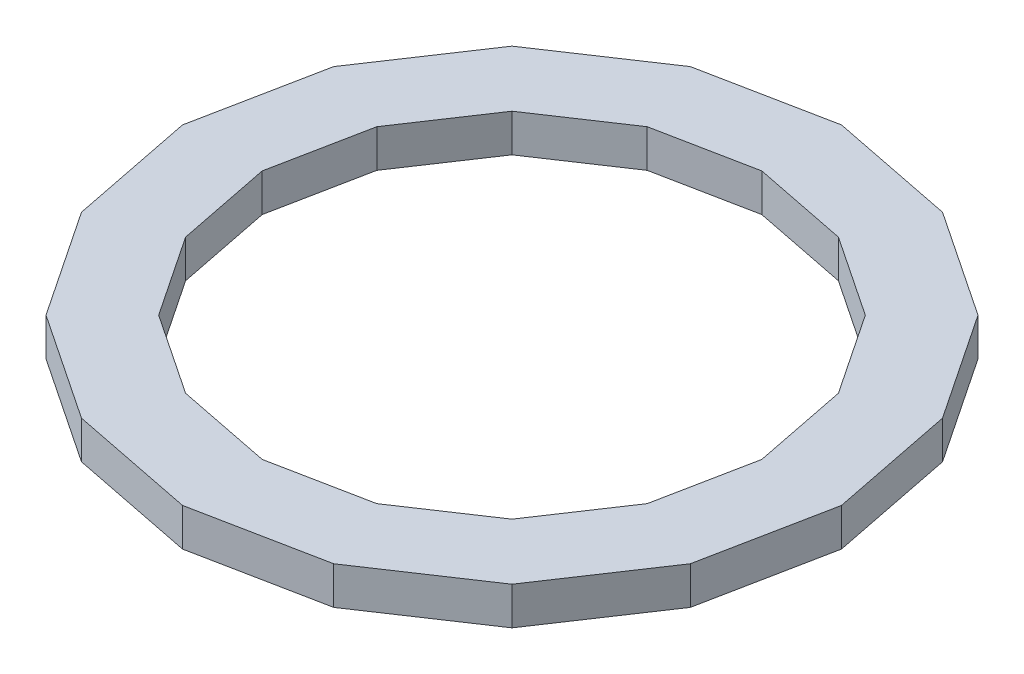
ISO-10303-21;
HEADER;
FILE_DESCRIPTION(('STEP AP214'),'2;1');
FILE_NAME('part.step','',(''),(''),'','','');
FILE_SCHEMA(('AUTOMOTIVE_DESIGN { 1 0 10303 214 1 1 1 1 }'));
ENDSEC;
DATA;
#1=APPLICATION_CONTEXT('core data for automotive mechanical design processes');
#2=APPLICATION_PROTOCOL_DEFINITION('international standard','automotive_design',2000,#1);
#3=PRODUCT_CONTEXT('',#1,'mechanical');
#4=PRODUCT('Part','Part','',(#3));
#5=PRODUCT_RELATED_PRODUCT_CATEGORY('part','',(#4));
#6=PRODUCT_DEFINITION_FORMATION('','',#4);
#7=PRODUCT_DEFINITION_CONTEXT('part definition',#1,'design');
#8=PRODUCT_DEFINITION('design','',#6,#7);
#9=PRODUCT_DEFINITION_SHAPE('','',#8);
#10=(LENGTH_UNIT() NAMED_UNIT(*) SI_UNIT(.MILLI.,.METRE.));
#11=(NAMED_UNIT(*) PLANE_ANGLE_UNIT() SI_UNIT($,.RADIAN.));
#12=(NAMED_UNIT(*) SI_UNIT($,.STERADIAN.) SOLID_ANGLE_UNIT());
#13=UNCERTAINTY_MEASURE_WITH_UNIT(LENGTH_MEASURE(1.E-05),#10,'distance_accuracy_value','');
#14=(GEOMETRIC_REPRESENTATION_CONTEXT(3) GLOBAL_UNCERTAINTY_ASSIGNED_CONTEXT((#13)) GLOBAL_UNIT_ASSIGNED_CONTEXT((#10,
#11,#12)) REPRESENTATION_CONTEXT('',''));
#15=CARTESIAN_POINT('',(0.,0.,0.));
#16=DIRECTION('',(0.,0.,1.));
#17=DIRECTION('',(1.,0.,0.));
#18=AXIS2_PLACEMENT_3D('',#15,#16,#17);
#19=CARTESIAN_POINT('',(0.,19.05,0.));
#20=DIRECTION('',(0.,1.,0.));
#21=DIRECTION('',(0.,0.,1.));
#22=AXIS2_PLACEMENT_3D('',#19,#20,#21);
#23=PLANE('',#22);
#24=DIRECTION('',(0.195090322016117,0.,-0.980785280403233));
#25=VECTOR('',#24,1.);
#26=CARTESIAN_POINT('',(153.364033393234,19.05,63.5254626117155));
#27=LINE('',#26,#25);
#28=CARTESIAN_POINT('',(153.364033393234,19.05,63.5254626117155));
#29=VERTEX_POINT('',#28);
#30=CARTESIAN_POINT('',(166.000033550217,19.05,-1.93594883098003E-12));
#31=VERTEX_POINT('',#30);
#32=EDGE_CURVE('E379',#29,#31,#27,.T.);
#33=ORIENTED_EDGE('',*,*,#32,.T.);
#34=DIRECTION('',(-0.19509032201614,0.,-0.980785280403228));
#35=VECTOR('',#34,1.);
#36=CARTESIAN_POINT('',(166.000033550217,19.05,-1.93594883098003E-12));
#37=LINE('',#36,#35);
#38=CARTESIAN_POINT('',(153.364033393232,19.05,-63.525462611719));
#39=VERTEX_POINT('',#38);
#40=EDGE_CURVE('E382',#31,#39,#37,.T.);
#41=ORIENTED_EDGE('',*,*,#40,.T.);
#42=DIRECTION('',(-0.555570233019612,0.,-0.831469612302539));
#43=VECTOR('',#42,1.);
#44=CARTESIAN_POINT('',(153.364033393232,19.05,-63.525462611719));
#45=LINE('',#44,#43);
#46=CARTESIAN_POINT('',(117.379749400552,19.05,-117.379749400555));
#47=VERTEX_POINT('',#46);
#48=EDGE_CURVE('E385',#39,#47,#45,.T.);
#49=ORIENTED_EDGE('',*,*,#48,.T.);
#50=DIRECTION('',(-0.831469612302552,0.,-0.555570233019593));
#51=VECTOR('',#50,1.);
#52=CARTESIAN_POINT('',(117.379749400552,19.05,-117.379749400555));
#53=LINE('',#52,#51);
#54=CARTESIAN_POINT('',(63.5254626117154,19.05,-153.364033393234));
#55=VERTEX_POINT('',#54);
#56=EDGE_CURVE('E387',#47,#55,#53,.T.);
#57=ORIENTED_EDGE('',*,*,#56,.T.);
#58=DIRECTION('',(-0.980785280403233,0.,-0.195090322016116));
#59=VECTOR('',#58,1.);
#60=CARTESIAN_POINT('',(63.5254626117154,19.05,-153.364033393234));
#61=LINE('',#60,#59);
#62=CARTESIAN_POINT('',(-1.93612096258512E-12,19.05,-166.000033550217));
#63=VERTEX_POINT('',#62);
#64=EDGE_CURVE('E389',#55,#63,#61,.T.);
#65=ORIENTED_EDGE('',*,*,#64,.T.);
#66=DIRECTION('',(-0.980785280403228,0.,0.19509032201614));
#67=VECTOR('',#66,1.);
#68=CARTESIAN_POINT('',(-1.93612096258512E-12,19.05,-166.000033550217));
#69=LINE('',#68,#67);
#70=CARTESIAN_POINT('',(-63.5254626117191,19.05,-153.364033393232));
#71=VERTEX_POINT('',#70);
#72=EDGE_CURVE('E391',#63,#71,#69,.T.);
#73=ORIENTED_EDGE('',*,*,#72,.T.);
#74=DIRECTION('',(-0.831469612302539,0.,0.555570233019612));
#75=VECTOR('',#74,1.);
#76=CARTESIAN_POINT('',(-63.5254626117191,19.05,-153.364033393232));
#77=LINE('',#76,#75);
#78=CARTESIAN_POINT('',(-117.379749400555,19.05,-117.379749400552));
#79=VERTEX_POINT('',#78);
#80=EDGE_CURVE('E393',#71,#79,#77,.T.);
#81=ORIENTED_EDGE('',*,*,#80,.T.);
#82=DIRECTION('',(-0.555570233019592,0.,0.831469612302552));
#83=VECTOR('',#82,1.);
#84=CARTESIAN_POINT('',(-117.379749400555,19.05,-117.379749400552));
#85=LINE('',#84,#83);
#86=CARTESIAN_POINT('',(-153.364033393234,19.05,-63.5254626117155));
#87=VERTEX_POINT('',#86);
#88=EDGE_CURVE('E395',#79,#87,#85,.T.);
#89=ORIENTED_EDGE('',*,*,#88,.T.);
#90=DIRECTION('',(-0.195090322016117,0.,0.980785280403233));
#91=VECTOR('',#90,1.);
#92=CARTESIAN_POINT('',(-153.364033393234,19.05,-63.5254626117155));
#93=LINE('',#92,#91);
#94=CARTESIAN_POINT('',(-166.000033550217,19.05,1.90871266716708E-12));
#95=VERTEX_POINT('',#94);
#96=EDGE_CURVE('E398',#87,#95,#93,.T.);
#97=ORIENTED_EDGE('',*,*,#96,.T.);
#98=DIRECTION('',(0.195090322016139,0.,0.980785280403228));
#99=VECTOR('',#98,1.);
#100=CARTESIAN_POINT('',(-166.000033550217,19.05,1.90871266716708E-12));
#101=LINE('',#100,#99);
#102=CARTESIAN_POINT('',(-153.364033393232,19.05,63.5254626117191));
#103=VERTEX_POINT('',#102);
#104=EDGE_CURVE('E400',#95,#103,#101,.T.);
#105=ORIENTED_EDGE('',*,*,#104,.T.);
#106=DIRECTION('',(0.555570233019612,0.,0.831469612302538));
#107=VECTOR('',#106,1.);
#108=CARTESIAN_POINT('',(-153.364033393232,19.05,63.5254626117191));
#109=LINE('',#108,#107);
#110=CARTESIAN_POINT('',(-117.379749400552,19.05,117.379749400555));
#111=VERTEX_POINT('',#110);
#112=EDGE_CURVE('E402',#103,#111,#109,.T.);
#113=ORIENTED_EDGE('',*,*,#112,.T.);
#114=DIRECTION('',(0.831469612302551,0.,0.555570233019593));
#115=VECTOR('',#114,1.);
#116=CARTESIAN_POINT('',(-117.379749400552,19.05,117.379749400555));
#117=LINE('',#116,#115);
#118=CARTESIAN_POINT('',(-63.5254626117155,19.05,153.364033393234));
#119=VERTEX_POINT('',#118);
#120=EDGE_CURVE('E405',#111,#119,#117,.T.);
#121=ORIENTED_EDGE('',*,*,#120,.T.);
#122=DIRECTION('',(0.980785280403233,0.,0.195090322016117));
#123=VECTOR('',#122,1.);
#124=CARTESIAN_POINT('',(-63.5254626117155,19.05,153.364033393234));
#125=LINE('',#124,#123);
#126=CARTESIAN_POINT('',(1.94174011063773E-12,19.05,166.000033550217));
#127=VERTEX_POINT('',#126);
#128=EDGE_CURVE('E408',#119,#127,#125,.T.);
#129=ORIENTED_EDGE('',*,*,#128,.T.);
#130=DIRECTION('',(0.980785280403228,0.,-0.195090322016139));
#131=VECTOR('',#130,1.);
#132=CARTESIAN_POINT('',(1.94174011063773E-12,19.05,166.000033550217));
#133=LINE('',#132,#131);
#134=CARTESIAN_POINT('',(63.5254626117191,19.05,153.364033393232));
#135=VERTEX_POINT('',#134);
#136=EDGE_CURVE('E410',#127,#135,#133,.T.);
#137=ORIENTED_EDGE('',*,*,#136,.T.);
#138=DIRECTION('',(0.831469612302538,0.,-0.555570233019612));
#139=VECTOR('',#138,1.);
#140=CARTESIAN_POINT('',(63.5254626117191,19.05,153.364033393232));
#141=LINE('',#140,#139);
#142=CARTESIAN_POINT('',(117.379749400555,19.05,117.379749400552));
#143=VERTEX_POINT('',#142);
#144=EDGE_CURVE('E413',#135,#143,#141,.T.);
#145=ORIENTED_EDGE('',*,*,#144,.T.);
#146=DIRECTION('',(0.555570233019592,0.,-0.831469612302552));
#147=VECTOR('',#146,1.);
#148=CARTESIAN_POINT('',(117.379749400555,19.05,117.379749400552));
#149=LINE('',#148,#147);
#150=EDGE_CURVE('E416',#143,#29,#149,.T.);
#151=ORIENTED_EDGE('',*,*,#150,.T.);
#152=EDGE_LOOP('',(#33,#41,#49,#57,#65,#73,#81,#89,#97,#105,#113,#121,#129,#137,#145,#151));
#153=FACE_BOUND('',#152,.T.);
#154=DIRECTION('',(-0.19509032201614,0.,-0.980785280403228));
#155=VECTOR('',#154,1.);
#156=CARTESIAN_POINT('',(125.858729651556,19.05,-1.52618135987118E-12));
#157=LINE('',#156,#155);
#158=CARTESIAN_POINT('',(125.858729651556,19.05,-1.52618135987118E-12));
#159=VERTEX_POINT('',#158);
#160=CARTESIAN_POINT('',(116.278304312943,19.05,-48.1640506561687));
#161=VERTEX_POINT('',#160);
#162=EDGE_CURVE('E252',#159,#161,#157,.T.);
#163=ORIENTED_EDGE('',*,*,#162,.F.);
#164=DIRECTION('',(0.195090322016116,0.,-0.980785280403233));
#165=VECTOR('',#164,1.);
#166=CARTESIAN_POINT('',(116.278304312945,19.05,48.1640506561659));
#167=LINE('',#166,#165);
#168=CARTESIAN_POINT('',(116.278304312945,19.05,48.1640506561659));
#169=VERTEX_POINT('',#168);
#170=EDGE_CURVE('E243',#169,#159,#167,.T.);
#171=ORIENTED_EDGE('',*,*,#170,.F.);
#172=DIRECTION('',(0.555570233019592,0.,-0.831469612302552));
#173=VECTOR('',#172,1.);
#174=CARTESIAN_POINT('',(88.9955612081407,19.05,88.9955612081386));
#175=LINE('',#174,#173);
#176=CARTESIAN_POINT('',(88.9955612081407,19.05,88.9955612081386));
#177=VERTEX_POINT('',#176);
#178=EDGE_CURVE('E299',#177,#169,#175,.T.);
#179=ORIENTED_EDGE('',*,*,#178,.F.);
#180=DIRECTION('',(0.831469612302538,0.,-0.555570233019612));
#181=VECTOR('',#180,1.);
#182=CARTESIAN_POINT('',(48.1640506561688,19.05,116.278304312943));
#183=LINE('',#182,#181);
#184=CARTESIAN_POINT('',(48.1640506561688,19.05,116.278304312943));
#185=VERTEX_POINT('',#184);
#186=EDGE_CURVE('E297',#185,#177,#183,.T.);
#187=ORIENTED_EDGE('',*,*,#186,.F.);
#188=DIRECTION('',(0.980785280403228,0.,-0.19509032201614));
#189=VECTOR('',#188,1.);
#190=CARTESIAN_POINT('',(1.49950221880281E-12,19.05,125.858729651556));
#191=LINE('',#190,#189);
#192=CARTESIAN_POINT('',(1.49950221880281E-12,19.05,125.858729651556));
#193=VERTEX_POINT('',#192);
#194=EDGE_CURVE('E295',#193,#185,#191,.T.);
#195=ORIENTED_EDGE('',*,*,#194,.F.);
#196=DIRECTION('',(0.980785280403233,0.,0.195090322016116));
#197=VECTOR('',#196,1.);
#198=CARTESIAN_POINT('',(-48.1640506561659,19.05,116.278304312945));
#199=LINE('',#198,#197);
#200=CARTESIAN_POINT('',(-48.1640506561659,19.05,116.278304312945));
#201=VERTEX_POINT('',#200);
#202=EDGE_CURVE('E293',#201,#193,#199,.T.);
#203=ORIENTED_EDGE('',*,*,#202,.F.);
#204=DIRECTION('',(0.831469612302552,0.,0.555570233019592));
#205=VECTOR('',#204,1.);
#206=CARTESIAN_POINT('',(-88.9955612081385,19.05,88.9955612081407));
#207=LINE('',#206,#205);
#208=CARTESIAN_POINT('',(-88.9955612081385,19.05,88.9955612081407));
#209=VERTEX_POINT('',#208);
#210=EDGE_CURVE('E291',#209,#201,#207,.T.);
#211=ORIENTED_EDGE('',*,*,#210,.F.);
#212=DIRECTION('',(0.555570233019612,0.,0.831469612302538));
#213=VECTOR('',#212,1.);
#214=CARTESIAN_POINT('',(-116.278304312943,19.05,48.1640506561687));
#215=LINE('',#214,#213);
#216=CARTESIAN_POINT('',(-116.278304312943,19.05,48.1640506561687));
#217=VERTEX_POINT('',#216);
#218=EDGE_CURVE('E288',#217,#209,#215,.T.);
#219=ORIENTED_EDGE('',*,*,#218,.F.);
#220=DIRECTION('',(0.19509032201614,0.,0.980785280403228));
#221=VECTOR('',#220,1.);
#222=CARTESIAN_POINT('',(-125.858729651556,19.05,1.47828030419477E-12));
#223=LINE('',#222,#221);
#224=CARTESIAN_POINT('',(-125.858729651556,19.05,1.47828030419477E-12));
#225=VERTEX_POINT('',#224);
#226=EDGE_CURVE('E285',#225,#217,#223,.T.);
#227=ORIENTED_EDGE('',*,*,#226,.F.);
#228=DIRECTION('',(-0.195090322016116,0.,0.980785280403233));
#229=VECTOR('',#228,1.);
#230=CARTESIAN_POINT('',(-116.278304312945,19.05,-48.1640506561659));
#231=LINE('',#230,#229);
#232=CARTESIAN_POINT('',(-116.278304312945,19.05,-48.1640506561659));
#233=VERTEX_POINT('',#232);
#234=EDGE_CURVE('E282',#233,#225,#231,.T.);
#235=ORIENTED_EDGE('',*,*,#234,.F.);
#236=DIRECTION('',(-0.555570233019592,0.,0.831469612302552));
#237=VECTOR('',#236,1.);
#238=CARTESIAN_POINT('',(-88.9955612081407,19.05,-88.9955612081386));
#239=LINE('',#238,#237);
#240=CARTESIAN_POINT('',(-88.9955612081407,19.05,-88.9955612081386));
#241=VERTEX_POINT('',#240);
#242=EDGE_CURVE('E279',#241,#233,#239,.T.);
#243=ORIENTED_EDGE('',*,*,#242,.F.);
#244=DIRECTION('',(-0.831469612302538,0.,0.555570233019613));
#245=VECTOR('',#244,1.);
#246=CARTESIAN_POINT('',(-48.1640506561688,19.05,-116.278304312943));
#247=LINE('',#246,#245);
#248=CARTESIAN_POINT('',(-48.1640506561688,19.05,-116.278304312943));
#249=VERTEX_POINT('',#248);
#250=EDGE_CURVE('E277',#249,#241,#247,.T.);
#251=ORIENTED_EDGE('',*,*,#250,.F.);
#252=DIRECTION('',(-0.980785280403228,0.,0.19509032201614));
#253=VECTOR('',#252,1.);
#254=CARTESIAN_POINT('',(-1.52673570788957E-12,19.05,-125.858729651556));
#255=LINE('',#254,#253);
#256=CARTESIAN_POINT('',(-1.52673570788957E-12,19.05,-125.858729651556));
#257=VERTEX_POINT('',#256);
#258=EDGE_CURVE('E275',#257,#249,#255,.T.);
#259=ORIENTED_EDGE('',*,*,#258,.F.);
#260=DIRECTION('',(-0.980785280403233,0.,-0.195090322016116));
#261=VECTOR('',#260,1.);
#262=CARTESIAN_POINT('',(48.1640506561659,19.05,-116.278304312945));
#263=LINE('',#262,#261);
#264=CARTESIAN_POINT('',(48.1640506561659,19.05,-116.278304312945));
#265=VERTEX_POINT('',#264);
#266=EDGE_CURVE('E272',#265,#257,#263,.T.);
#267=ORIENTED_EDGE('',*,*,#266,.F.);
#268=DIRECTION('',(-0.831469612302552,0.,-0.555570233019592));
#269=VECTOR('',#268,1.);
#270=CARTESIAN_POINT('',(88.9955612081385,19.05,-88.9955612081407));
#271=LINE('',#270,#269);
#272=CARTESIAN_POINT('',(88.9955612081385,19.05,-88.9955612081407));
#273=VERTEX_POINT('',#272);
#274=EDGE_CURVE('E268',#273,#265,#271,.T.);
#275=ORIENTED_EDGE('',*,*,#274,.F.);
#276=DIRECTION('',(-0.555570233019612,0.,-0.831469612302538));
#277=VECTOR('',#276,1.);
#278=CARTESIAN_POINT('',(116.278304312943,19.05,-48.1640506561687));
#279=LINE('',#278,#277);
#280=EDGE_CURVE('E266',#161,#273,#279,.T.);
#281=ORIENTED_EDGE('',*,*,#280,.F.);
#282=EDGE_LOOP('',(#163,#171,#179,#187,#195,#203,#211,#219,#227,#235,#243,#251,#259,#267,#275,#281));
#283=FACE_BOUND('',#282,.T.);
#284=ADVANCED_FACE('F34',(#153,#283),#23,.T.);
#285=CARTESIAN_POINT('',(0.,0.,0.));
#286=DIRECTION('',(0.,1.,0.));
#287=DIRECTION('',(0.,0.,1.));
#288=AXIS2_PLACEMENT_3D('',#285,#286,#287);
#289=PLANE('',#288);
#290=DIRECTION('',(0.195090322016117,0.,-0.980785280403233));
#291=VECTOR('',#290,1.);
#292=CARTESIAN_POINT('',(153.364033393234,0.,63.5254626117155));
#293=LINE('',#292,#291);
#294=CARTESIAN_POINT('',(153.364033393234,0.,63.5254626117155));
#295=VERTEX_POINT('',#294);
#296=CARTESIAN_POINT('',(166.000033550217,0.,-1.93594883098003E-12));
#297=VERTEX_POINT('',#296);
#298=EDGE_CURVE('E261',#295,#297,#293,.T.);
#299=ORIENTED_EDGE('',*,*,#298,.F.);
#300=DIRECTION('',(0.555570233019592,0.,-0.831469612302552));
#301=VECTOR('',#300,1.);
#302=CARTESIAN_POINT('',(117.379749400555,0.,117.379749400552));
#303=LINE('',#302,#301);
#304=CARTESIAN_POINT('',(117.379749400555,0.,117.379749400552));
#305=VERTEX_POINT('',#304);
#306=EDGE_CURVE('E383',#305,#295,#303,.T.);
#307=ORIENTED_EDGE('',*,*,#306,.F.);
#308=DIRECTION('',(0.831469612302538,0.,-0.555570233019612));
#309=VECTOR('',#308,1.);
#310=CARTESIAN_POINT('',(63.5254626117191,0.,153.364033393232));
#311=LINE('',#310,#309);
#312=CARTESIAN_POINT('',(63.5254626117191,0.,153.364033393232));
#313=VERTEX_POINT('',#312);
#314=EDGE_CURVE('E451',#313,#305,#311,.T.);
#315=ORIENTED_EDGE('',*,*,#314,.F.);
#316=DIRECTION('',(0.980785280403228,0.,-0.195090322016139));
#317=VECTOR('',#316,1.);
#318=CARTESIAN_POINT('',(1.94174011063773E-12,0.,166.000033550217));
#319=LINE('',#318,#317);
#320=CARTESIAN_POINT('',(1.94174011063773E-12,0.,166.000033550217));
#321=VERTEX_POINT('',#320);
#322=EDGE_CURVE('E448',#321,#313,#319,.T.);
#323=ORIENTED_EDGE('',*,*,#322,.F.);
#324=DIRECTION('',(0.980785280403233,0.,0.195090322016117));
#325=VECTOR('',#324,1.);
#326=CARTESIAN_POINT('',(-63.5254626117155,0.,153.364033393234));
#327=LINE('',#326,#325);
#328=CARTESIAN_POINT('',(-63.5254626117155,0.,153.364033393234));
#329=VERTEX_POINT('',#328);
#330=EDGE_CURVE('E445',#329,#321,#327,.T.);
#331=ORIENTED_EDGE('',*,*,#330,.F.);
#332=DIRECTION('',(0.831469612302551,0.,0.555570233019593));
#333=VECTOR('',#332,1.);
#334=CARTESIAN_POINT('',(-117.379749400552,0.,117.379749400555));
#335=LINE('',#334,#333);
#336=CARTESIAN_POINT('',(-117.379749400552,0.,117.379749400555));
#337=VERTEX_POINT('',#336);
#338=EDGE_CURVE('E442',#337,#329,#335,.T.);
#339=ORIENTED_EDGE('',*,*,#338,.F.);
#340=DIRECTION('',(0.555570233019612,0.,0.831469612302538));
#341=VECTOR('',#340,1.);
#342=CARTESIAN_POINT('',(-153.364033393232,0.,63.5254626117191));
#343=LINE('',#342,#341);
#344=CARTESIAN_POINT('',(-153.364033393232,0.,63.5254626117191));
#345=VERTEX_POINT('',#344);
#346=EDGE_CURVE('E440',#345,#337,#343,.T.);
#347=ORIENTED_EDGE('',*,*,#346,.F.);
#348=DIRECTION('',(0.195090322016139,0.,0.980785280403228));
#349=VECTOR('',#348,1.);
#350=CARTESIAN_POINT('',(-166.000033550217,0.,1.90871266716708E-12));
#351=LINE('',#350,#349);
#352=CARTESIAN_POINT('',(-166.000033550217,0.,1.90871266716708E-12));
#353=VERTEX_POINT('',#352);
#354=EDGE_CURVE('E437',#353,#345,#351,.T.);
#355=ORIENTED_EDGE('',*,*,#354,.F.);
#356=DIRECTION('',(-0.195090322016117,0.,0.980785280403233));
#357=VECTOR('',#356,1.);
#358=CARTESIAN_POINT('',(-153.364033393234,0.,-63.5254626117155));
#359=LINE('',#358,#357);
#360=CARTESIAN_POINT('',(-153.364033393234,0.,-63.5254626117155));
#361=VERTEX_POINT('',#360);
#362=EDGE_CURVE('E435',#361,#353,#359,.T.);
#363=ORIENTED_EDGE('',*,*,#362,.F.);
#364=DIRECTION('',(-0.555570233019592,0.,0.831469612302552));
#365=VECTOR('',#364,1.);
#366=CARTESIAN_POINT('',(-117.379749400555,0.,-117.379749400552));
#367=LINE('',#366,#365);
#368=CARTESIAN_POINT('',(-117.379749400555,0.,-117.379749400552));
#369=VERTEX_POINT('',#368);
#370=EDGE_CURVE('E433',#369,#361,#367,.T.);
#371=ORIENTED_EDGE('',*,*,#370,.F.);
#372=DIRECTION('',(-0.831469612302539,0.,0.555570233019612));
#373=VECTOR('',#372,1.);
#374=CARTESIAN_POINT('',(-63.5254626117191,0.,-153.364033393232));
#375=LINE('',#374,#373);
#376=CARTESIAN_POINT('',(-63.5254626117191,0.,-153.364033393232));
#377=VERTEX_POINT('',#376);
#378=EDGE_CURVE('E431',#377,#369,#375,.T.);
#379=ORIENTED_EDGE('',*,*,#378,.F.);
#380=DIRECTION('',(-0.980785280403228,0.,0.19509032201614));
#381=VECTOR('',#380,1.);
#382=CARTESIAN_POINT('',(-1.93612096258512E-12,0.,-166.000033550217));
#383=LINE('',#382,#381);
#384=CARTESIAN_POINT('',(-1.93612096258512E-12,0.,-166.000033550217));
#385=VERTEX_POINT('',#384);
#386=EDGE_CURVE('E429',#385,#377,#383,.T.);
#387=ORIENTED_EDGE('',*,*,#386,.F.);
#388=DIRECTION('',(-0.980785280403233,0.,-0.195090322016116));
#389=VECTOR('',#388,1.);
#390=CARTESIAN_POINT('',(63.5254626117154,0.,-153.364033393234));
#391=LINE('',#390,#389);
#392=CARTESIAN_POINT('',(63.5254626117154,0.,-153.364033393234));
#393=VERTEX_POINT('',#392);
#394=EDGE_CURVE('E427',#393,#385,#391,.T.);
#395=ORIENTED_EDGE('',*,*,#394,.F.);
#396=DIRECTION('',(-0.831469612302552,0.,-0.555570233019593));
#397=VECTOR('',#396,1.);
#398=CARTESIAN_POINT('',(117.379749400552,0.,-117.379749400555));
#399=LINE('',#398,#397);
#400=CARTESIAN_POINT('',(117.379749400552,0.,-117.379749400555));
#401=VERTEX_POINT('',#400);
#402=EDGE_CURVE('E425',#401,#393,#399,.T.);
#403=ORIENTED_EDGE('',*,*,#402,.F.);
#404=DIRECTION('',(-0.555570233019612,0.,-0.831469612302539));
#405=VECTOR('',#404,1.);
#406=CARTESIAN_POINT('',(153.364033393232,0.,-63.525462611719));
#407=LINE('',#406,#405);
#408=CARTESIAN_POINT('',(153.364033393232,0.,-63.525462611719));
#409=VERTEX_POINT('',#408);
#410=EDGE_CURVE('E423',#409,#401,#407,.T.);
#411=ORIENTED_EDGE('',*,*,#410,.F.);
#412=DIRECTION('',(-0.19509032201614,0.,-0.980785280403228));
#413=VECTOR('',#412,1.);
#414=CARTESIAN_POINT('',(166.000033550217,0.,-1.93594883098003E-12));
#415=LINE('',#414,#413);
#416=EDGE_CURVE('E421',#297,#409,#415,.T.);
#417=ORIENTED_EDGE('',*,*,#416,.F.);
#418=EDGE_LOOP('',(#299,#307,#315,#323,#331,#339,#347,#355,#363,#371,#379,#387,#395,#403,#411,#417));
#419=FACE_BOUND('',#418,.T.);
#420=DIRECTION('',(0.195090322016116,0.,-0.980785280403233));
#421=VECTOR('',#420,1.);
#422=CARTESIAN_POINT('',(116.278304312945,0.,48.1640506561659));
#423=LINE('',#422,#421);
#424=CARTESIAN_POINT('',(116.278304312945,0.,48.1640506561659));
#425=VERTEX_POINT('',#424);
#426=CARTESIAN_POINT('',(125.858729651556,0.,-1.52618135987118E-12));
#427=VERTEX_POINT('',#426);
#428=EDGE_CURVE('E57',#425,#427,#423,.T.);
#429=ORIENTED_EDGE('',*,*,#428,.T.);
#430=DIRECTION('',(-0.19509032201614,0.,-0.980785280403228));
#431=VECTOR('',#430,1.);
#432=CARTESIAN_POINT('',(125.858729651556,0.,-1.52618135987118E-12));
#433=LINE('',#432,#431);
#434=CARTESIAN_POINT('',(116.278304312943,0.,-48.1640506561687));
#435=VERTEX_POINT('',#434);
#436=EDGE_CURVE('E259',#427,#435,#433,.T.);
#437=ORIENTED_EDGE('',*,*,#436,.T.);
#438=DIRECTION('',(-0.555570233019612,0.,-0.831469612302538));
#439=VECTOR('',#438,1.);
#440=CARTESIAN_POINT('',(116.278304312943,0.,-48.1640506561687));
#441=LINE('',#440,#439);
#442=CARTESIAN_POINT('',(88.9955612081385,0.,-88.9955612081407));
#443=VERTEX_POINT('',#442);
#444=EDGE_CURVE('E303',#435,#443,#441,.T.);
#445=ORIENTED_EDGE('',*,*,#444,.T.);
#446=DIRECTION('',(-0.831469612302552,0.,-0.555570233019592));
#447=VECTOR('',#446,1.);
#448=CARTESIAN_POINT('',(88.9955612081385,0.,-88.9955612081407));
#449=LINE('',#448,#447);
#450=CARTESIAN_POINT('',(48.1640506561659,0.,-116.278304312945));
#451=VERTEX_POINT('',#450);
#452=EDGE_CURVE('E306',#443,#451,#449,.T.);
#453=ORIENTED_EDGE('',*,*,#452,.T.);
#454=DIRECTION('',(-0.980785280403233,0.,-0.195090322016116));
#455=VECTOR('',#454,1.);
#456=CARTESIAN_POINT('',(48.1640506561659,0.,-116.278304312945));
#457=LINE('',#456,#455);
#458=CARTESIAN_POINT('',(-1.52673570788957E-12,0.,-125.858729651556));
#459=VERTEX_POINT('',#458);
#460=EDGE_CURVE('E309',#451,#459,#457,.T.);
#461=ORIENTED_EDGE('',*,*,#460,.T.);
#462=DIRECTION('',(-0.980785280403228,0.,0.19509032201614));
#463=VECTOR('',#462,1.);
#464=CARTESIAN_POINT('',(-1.52673570788957E-12,0.,-125.858729651556));
#465=LINE('',#464,#463);
#466=CARTESIAN_POINT('',(-48.1640506561688,0.,-116.278304312943));
#467=VERTEX_POINT('',#466);
#468=EDGE_CURVE('E313',#459,#467,#465,.T.);
#469=ORIENTED_EDGE('',*,*,#468,.T.);
#470=DIRECTION('',(-0.831469612302538,0.,0.555570233019613));
#471=VECTOR('',#470,1.);
#472=CARTESIAN_POINT('',(-48.1640506561688,0.,-116.278304312943));
#473=LINE('',#472,#471);
#474=CARTESIAN_POINT('',(-88.9955612081407,0.,-88.9955612081386));
#475=VERTEX_POINT('',#474);
#476=EDGE_CURVE('E316',#467,#475,#473,.T.);
#477=ORIENTED_EDGE('',*,*,#476,.T.);
#478=DIRECTION('',(-0.555570233019592,0.,0.831469612302552));
#479=VECTOR('',#478,1.);
#480=CARTESIAN_POINT('',(-88.9955612081407,0.,-88.9955612081386));
#481=LINE('',#480,#479);
#482=CARTESIAN_POINT('',(-116.278304312945,0.,-48.1640506561659));
#483=VERTEX_POINT('',#482);
#484=EDGE_CURVE('E319',#475,#483,#481,.T.);
#485=ORIENTED_EDGE('',*,*,#484,.T.);
#486=DIRECTION('',(-0.195090322016116,0.,0.980785280403233));
#487=VECTOR('',#486,1.);
#488=CARTESIAN_POINT('',(-116.278304312945,0.,-48.1640506561659));
#489=LINE('',#488,#487);
#490=CARTESIAN_POINT('',(-125.858729651556,0.,1.47828030419477E-12));
#491=VERTEX_POINT('',#490);
#492=EDGE_CURVE('E322',#483,#491,#489,.T.);
#493=ORIENTED_EDGE('',*,*,#492,.T.);
#494=DIRECTION('',(0.19509032201614,0.,0.980785280403228));
#495=VECTOR('',#494,1.);
#496=CARTESIAN_POINT('',(-125.858729651556,0.,1.47828030419477E-12));
#497=LINE('',#496,#495);
#498=CARTESIAN_POINT('',(-116.278304312943,0.,48.1640506561687));
#499=VERTEX_POINT('',#498);
#500=EDGE_CURVE('E326',#491,#499,#497,.T.);
#501=ORIENTED_EDGE('',*,*,#500,.T.);
#502=DIRECTION('',(0.555570233019612,0.,0.831469612302538));
#503=VECTOR('',#502,1.);
#504=CARTESIAN_POINT('',(-116.278304312943,0.,48.1640506561687));
#505=LINE('',#504,#503);
#506=CARTESIAN_POINT('',(-88.9955612081385,0.,88.9955612081407));
#507=VERTEX_POINT('',#506);
#508=EDGE_CURVE('E329',#499,#507,#505,.T.);
#509=ORIENTED_EDGE('',*,*,#508,.T.);
#510=DIRECTION('',(0.831469612302552,0.,0.555570233019592));
#511=VECTOR('',#510,1.);
#512=CARTESIAN_POINT('',(-88.9955612081385,0.,88.9955612081407));
#513=LINE('',#512,#511);
#514=CARTESIAN_POINT('',(-48.1640506561659,0.,116.278304312945));
#515=VERTEX_POINT('',#514);
#516=EDGE_CURVE('E332',#507,#515,#513,.T.);
#517=ORIENTED_EDGE('',*,*,#516,.T.);
#518=DIRECTION('',(0.980785280403233,0.,0.195090322016116));
#519=VECTOR('',#518,1.);
#520=CARTESIAN_POINT('',(-48.1640506561659,0.,116.278304312945));
#521=LINE('',#520,#519);
#522=CARTESIAN_POINT('',(1.49950221880281E-12,0.,125.858729651556));
#523=VERTEX_POINT('',#522);
#524=EDGE_CURVE('E335',#515,#523,#521,.T.);
#525=ORIENTED_EDGE('',*,*,#524,.T.);
#526=DIRECTION('',(0.980785280403228,0.,-0.19509032201614));
#527=VECTOR('',#526,1.);
#528=CARTESIAN_POINT('',(1.49950221880281E-12,0.,125.858729651556));
#529=LINE('',#528,#527);
#530=CARTESIAN_POINT('',(48.1640506561688,0.,116.278304312943));
#531=VERTEX_POINT('',#530);
#532=EDGE_CURVE('E338',#523,#531,#529,.T.);
#533=ORIENTED_EDGE('',*,*,#532,.T.);
#534=DIRECTION('',(0.831469612302538,0.,-0.555570233019612));
#535=VECTOR('',#534,1.);
#536=CARTESIAN_POINT('',(48.1640506561688,0.,116.278304312943));
#537=LINE('',#536,#535);
#538=CARTESIAN_POINT('',(88.9955612081407,0.,88.9955612081386));
#539=VERTEX_POINT('',#538);
#540=EDGE_CURVE('E342',#531,#539,#537,.T.);
#541=ORIENTED_EDGE('',*,*,#540,.T.);
#542=DIRECTION('',(0.555570233019592,0.,-0.831469612302552));
#543=VECTOR('',#542,1.);
#544=CARTESIAN_POINT('',(88.9955612081407,0.,88.9955612081386));
#545=LINE('',#544,#543);
#546=EDGE_CURVE('E253',#539,#425,#545,.T.);
#547=ORIENTED_EDGE('',*,*,#546,.T.);
#548=EDGE_LOOP('',(#429,#437,#445,#453,#461,#469,#477,#485,#493,#501,#509,#517,#525,#533,#541,#547));
#549=FACE_BOUND('',#548,.T.);
#550=ADVANCED_FACE('F509',(#419,#549),#289,.F.);
#551=CARTESIAN_POINT('',(153.364033393234,19.05,63.5254626117155));
#552=DIRECTION('',(-0.980785280403233,0.,-0.195090322016117));
#553=DIRECTION('',(-0.195090322016117,0.,0.980785280403233));
#554=AXIS2_PLACEMENT_3D('',#551,#552,#553);
#555=PLANE('',#554);
#556=ORIENTED_EDGE('',*,*,#298,.T.);
#557=DIRECTION('',(0.,-1.,0.));
#558=VECTOR('',#557,1.);
#559=CARTESIAN_POINT('',(166.000033550217,19.05,-1.93594883098003E-12));
#560=LINE('',#559,#558);
#561=EDGE_CURVE('E11',#31,#297,#560,.T.);
#562=ORIENTED_EDGE('',*,*,#561,.F.);
#563=ORIENTED_EDGE('',*,*,#32,.F.);
#564=DIRECTION('',(0.,-1.,0.));
#565=VECTOR('',#564,1.);
#566=CARTESIAN_POINT('',(153.364033393234,19.05,63.5254626117155));
#567=LINE('',#566,#565);
#568=EDGE_CURVE('E418',#29,#295,#567,.T.);
#569=ORIENTED_EDGE('',*,*,#568,.T.);
#570=EDGE_LOOP('',(#556,#562,#563,#569));
#571=FACE_BOUND('',#570,.T.);
#572=ADVANCED_FACE('F36',(#571),#555,.F.);
#573=CARTESIAN_POINT('',(166.000033550217,19.05,-1.93594883098003E-12));
#574=DIRECTION('',(-0.980785280403228,0.,0.19509032201614));
#575=DIRECTION('',(0.19509032201614,0.,0.980785280403228));
#576=AXIS2_PLACEMENT_3D('',#573,#574,#575);
#577=PLANE('',#576);
#578=ORIENTED_EDGE('',*,*,#416,.T.);
#579=DIRECTION('',(0.,-1.,0.));
#580=VECTOR('',#579,1.);
#581=CARTESIAN_POINT('',(153.364033393232,19.05,-63.525462611719));
#582=LINE('',#581,#580);
#583=EDGE_CURVE('E42',#39,#409,#582,.T.);
#584=ORIENTED_EDGE('',*,*,#583,.F.);
#585=ORIENTED_EDGE('',*,*,#40,.F.);
#586=ORIENTED_EDGE('',*,*,#561,.T.);
#587=EDGE_LOOP('',(#578,#584,#585,#586));
#588=FACE_BOUND('',#587,.T.);
#589=ADVANCED_FACE('F526',(#588),#577,.F.);
#590=CARTESIAN_POINT('',(153.364033393232,19.05,-63.525462611719));
#591=DIRECTION('',(-0.831469612302539,0.,0.555570233019612));
#592=DIRECTION('',(0.555570233019612,0.,0.831469612302539));
#593=AXIS2_PLACEMENT_3D('',#590,#591,#592);
#594=PLANE('',#593);
#595=ORIENTED_EDGE('',*,*,#410,.T.);
#596=DIRECTION('',(0.,-1.,0.));
#597=VECTOR('',#596,1.);
#598=CARTESIAN_POINT('',(117.379749400552,19.05,-117.379749400555));
#599=LINE('',#598,#597);
#600=EDGE_CURVE('E496',#47,#401,#599,.T.);
#601=ORIENTED_EDGE('',*,*,#600,.F.);
#602=ORIENTED_EDGE('',*,*,#48,.F.);
#603=ORIENTED_EDGE('',*,*,#583,.T.);
#604=EDGE_LOOP('',(#595,#601,#602,#603));
#605=FACE_BOUND('',#604,.T.);
#606=ADVANCED_FACE('F503',(#605),#594,.F.);
#607=CARTESIAN_POINT('',(117.379749400552,19.05,-117.379749400555));
#608=DIRECTION('',(-0.555570233019593,0.,0.831469612302552));
#609=DIRECTION('',(0.831469612302552,0.,0.555570233019593));
#610=AXIS2_PLACEMENT_3D('',#607,#608,#609);
#611=PLANE('',#610);
#612=ORIENTED_EDGE('',*,*,#402,.T.);
#613=DIRECTION('',(0.,-1.,0.));
#614=VECTOR('',#613,1.);
#615=CARTESIAN_POINT('',(63.5254626117154,19.05,-153.364033393234));
#616=LINE('',#615,#614);
#617=EDGE_CURVE('E492',#55,#393,#616,.T.);
#618=ORIENTED_EDGE('',*,*,#617,.F.);
#619=ORIENTED_EDGE('',*,*,#56,.F.);
#620=ORIENTED_EDGE('',*,*,#600,.T.);
#621=EDGE_LOOP('',(#612,#618,#619,#620));
#622=FACE_BOUND('',#621,.T.);
#623=ADVANCED_FACE('F515',(#622),#611,.F.);
#624=CARTESIAN_POINT('',(63.5254626117154,19.05,-153.364033393234));
#625=DIRECTION('',(-0.195090322016116,0.,0.980785280403233));
#626=DIRECTION('',(0.980785280403233,0.,0.195090322016116));
#627=AXIS2_PLACEMENT_3D('',#624,#625,#626);
#628=PLANE('',#627);
#629=ORIENTED_EDGE('',*,*,#394,.T.);
#630=DIRECTION('',(0.,-1.,0.));
#631=VECTOR('',#630,1.);
#632=CARTESIAN_POINT('',(-1.93612096258512E-12,19.05,-166.000033550217));
#633=LINE('',#632,#631);
#634=EDGE_CURVE('E488',#63,#385,#633,.T.);
#635=ORIENTED_EDGE('',*,*,#634,.F.);
#636=ORIENTED_EDGE('',*,*,#64,.F.);
#637=ORIENTED_EDGE('',*,*,#617,.T.);
#638=EDGE_LOOP('',(#629,#635,#636,#637));
#639=FACE_BOUND('',#638,.T.);
#640=ADVANCED_FACE('F519',(#639),#628,.F.);
#641=CARTESIAN_POINT('',(-1.93612096258512E-12,19.05,-166.000033550217));
#642=DIRECTION('',(0.19509032201614,0.,0.980785280403228));
#643=DIRECTION('',(0.980785280403228,0.,-0.19509032201614));
#644=AXIS2_PLACEMENT_3D('',#641,#642,#643);
#645=PLANE('',#644);
#646=ORIENTED_EDGE('',*,*,#386,.T.);
#647=DIRECTION('',(0.,-1.,0.));
#648=VECTOR('',#647,1.);
#649=CARTESIAN_POINT('',(-63.5254626117191,19.05,-153.364033393232));
#650=LINE('',#649,#648);
#651=EDGE_CURVE('E485',#71,#377,#650,.T.);
#652=ORIENTED_EDGE('',*,*,#651,.F.);
#653=ORIENTED_EDGE('',*,*,#72,.F.);
#654=ORIENTED_EDGE('',*,*,#634,.T.);
#655=EDGE_LOOP('',(#646,#652,#653,#654));
#656=FACE_BOUND('',#655,.T.);
#657=ADVANCED_FACE('F579',(#656),#645,.F.);
#658=CARTESIAN_POINT('',(-63.5254626117191,19.05,-153.364033393232));
#659=DIRECTION('',(0.555570233019612,0.,0.831469612302539));
#660=DIRECTION('',(0.831469612302539,0.,-0.555570233019612));
#661=AXIS2_PLACEMENT_3D('',#658,#659,#660);
#662=PLANE('',#661);
#663=ORIENTED_EDGE('',*,*,#378,.T.);
#664=DIRECTION('',(0.,-1.,0.));
#665=VECTOR('',#664,1.);
#666=CARTESIAN_POINT('',(-117.379749400555,19.05,-117.379749400552));
#667=LINE('',#666,#665);
#668=EDGE_CURVE('E482',#79,#369,#667,.T.);
#669=ORIENTED_EDGE('',*,*,#668,.F.);
#670=ORIENTED_EDGE('',*,*,#80,.F.);
#671=ORIENTED_EDGE('',*,*,#651,.T.);
#672=EDGE_LOOP('',(#663,#669,#670,#671));
#673=FACE_BOUND('',#672,.T.);
#674=ADVANCED_FACE('F576',(#673),#662,.F.);
#675=CARTESIAN_POINT('',(-117.379749400555,19.05,-117.379749400552));
#676=DIRECTION('',(0.831469612302552,0.,0.555570233019592));
#677=DIRECTION('',(0.555570233019592,0.,-0.831469612302552));
#678=AXIS2_PLACEMENT_3D('',#675,#676,#677);
#679=PLANE('',#678);
#680=ORIENTED_EDGE('',*,*,#370,.T.);
#681=DIRECTION('',(0.,-1.,0.));
#682=VECTOR('',#681,1.);
#683=CARTESIAN_POINT('',(-153.364033393234,19.05,-63.5254626117155));
#684=LINE('',#683,#682);
#685=EDGE_CURVE('E479',#87,#361,#684,.T.);
#686=ORIENTED_EDGE('',*,*,#685,.F.);
#687=ORIENTED_EDGE('',*,*,#88,.F.);
#688=ORIENTED_EDGE('',*,*,#668,.T.);
#689=EDGE_LOOP('',(#680,#686,#687,#688));
#690=FACE_BOUND('',#689,.T.);
#691=ADVANCED_FACE('F572',(#690),#679,.F.);
#692=CARTESIAN_POINT('',(-153.364033393234,19.05,-63.5254626117155));
#693=DIRECTION('',(0.980785280403233,0.,0.195090322016117));
#694=DIRECTION('',(0.195090322016117,0.,-0.980785280403233));
#695=AXIS2_PLACEMENT_3D('',#692,#693,#694);
#696=PLANE('',#695);
#697=ORIENTED_EDGE('',*,*,#362,.T.);
#698=DIRECTION('',(0.,-1.,0.));
#699=VECTOR('',#698,1.);
#700=CARTESIAN_POINT('',(-166.000033550217,19.05,1.90871266716708E-12));
#701=LINE('',#700,#699);
#702=EDGE_CURVE('E476',#95,#353,#701,.T.);
#703=ORIENTED_EDGE('',*,*,#702,.F.);
#704=ORIENTED_EDGE('',*,*,#96,.F.);
#705=ORIENTED_EDGE('',*,*,#685,.T.);
#706=EDGE_LOOP('',(#697,#703,#704,#705));
#707=FACE_BOUND('',#706,.T.);
#708=ADVANCED_FACE('F568',(#707),#696,.F.);
#709=CARTESIAN_POINT('',(-166.000033550217,19.05,1.90871266716708E-12));
#710=DIRECTION('',(0.980785280403228,0.,-0.195090322016139));
#711=DIRECTION('',(-0.195090322016139,0.,-0.980785280403228));
#712=AXIS2_PLACEMENT_3D('',#709,#710,#711);
#713=PLANE('',#712);
#714=ORIENTED_EDGE('',*,*,#354,.T.);
#715=DIRECTION('',(0.,-1.,0.));
#716=VECTOR('',#715,1.);
#717=CARTESIAN_POINT('',(-153.364033393232,19.05,63.5254626117191));
#718=LINE('',#717,#716);
#719=EDGE_CURVE('E472',#103,#345,#718,.T.);
#720=ORIENTED_EDGE('',*,*,#719,.F.);
#721=ORIENTED_EDGE('',*,*,#104,.F.);
#722=ORIENTED_EDGE('',*,*,#702,.T.);
#723=EDGE_LOOP('',(#714,#720,#721,#722));
#724=FACE_BOUND('',#723,.T.);
#725=ADVANCED_FACE('F563',(#724),#713,.F.);
#726=CARTESIAN_POINT('',(-153.364033393232,19.05,63.5254626117191));
#727=DIRECTION('',(0.831469612302538,0.,-0.555570233019612));
#728=DIRECTION('',(-0.555570233019613,0.,-0.831469612302539));
#729=AXIS2_PLACEMENT_3D('',#726,#727,#728);
#730=PLANE('',#729);
#731=ORIENTED_EDGE('',*,*,#346,.T.);
#732=DIRECTION('',(0.,-1.,0.));
#733=VECTOR('',#732,1.);
#734=CARTESIAN_POINT('',(-117.379749400552,19.05,117.379749400555));
#735=LINE('',#734,#733);
#736=EDGE_CURVE('E469',#111,#337,#735,.T.);
#737=ORIENTED_EDGE('',*,*,#736,.F.);
#738=ORIENTED_EDGE('',*,*,#112,.F.);
#739=ORIENTED_EDGE('',*,*,#719,.T.);
#740=EDGE_LOOP('',(#731,#737,#738,#739));
#741=FACE_BOUND('',#740,.T.);
#742=ADVANCED_FACE('F557',(#741),#730,.F.);
#743=CARTESIAN_POINT('',(-117.379749400552,19.05,117.379749400555));
#744=DIRECTION('',(0.555570233019593,0.,-0.831469612302552));
#745=DIRECTION('',(-0.831469612302552,0.,-0.555570233019593));
#746=AXIS2_PLACEMENT_3D('',#743,#744,#745);
#747=PLANE('',#746);
#748=ORIENTED_EDGE('',*,*,#338,.T.);
#749=DIRECTION('',(0.,-1.,0.));
#750=VECTOR('',#749,1.);
#751=CARTESIAN_POINT('',(-63.5254626117155,19.05,153.364033393234));
#752=LINE('',#751,#750);
#753=EDGE_CURVE('E466',#119,#329,#752,.T.);
#754=ORIENTED_EDGE('',*,*,#753,.F.);
#755=ORIENTED_EDGE('',*,*,#120,.F.);
#756=ORIENTED_EDGE('',*,*,#736,.T.);
#757=EDGE_LOOP('',(#748,#754,#755,#756));
#758=FACE_BOUND('',#757,.T.);
#759=ADVANCED_FACE('F553',(#758),#747,.F.);
#760=CARTESIAN_POINT('',(-63.5254626117155,19.05,153.364033393234));
#761=DIRECTION('',(0.195090322016117,0.,-0.980785280403233));
#762=DIRECTION('',(-0.980785280403233,0.,-0.195090322016117));
#763=AXIS2_PLACEMENT_3D('',#760,#761,#762);
#764=PLANE('',#763);
#765=ORIENTED_EDGE('',*,*,#330,.T.);
#766=DIRECTION('',(0.,-1.,0.));
#767=VECTOR('',#766,1.);
#768=CARTESIAN_POINT('',(1.94174011063773E-12,19.05,166.000033550217));
#769=LINE('',#768,#767);
#770=EDGE_CURVE('E462',#127,#321,#769,.T.);
#771=ORIENTED_EDGE('',*,*,#770,.F.);
#772=ORIENTED_EDGE('',*,*,#128,.F.);
#773=ORIENTED_EDGE('',*,*,#753,.T.);
#774=EDGE_LOOP('',(#765,#771,#772,#773));
#775=FACE_BOUND('',#774,.T.);
#776=ADVANCED_FACE('F548',(#775),#764,.F.);
#777=CARTESIAN_POINT('',(1.94174011063773E-12,19.05,166.000033550217));
#778=DIRECTION('',(-0.195090322016139,0.,-0.980785280403228));
#779=DIRECTION('',(-0.980785280403228,0.,0.195090322016139));
#780=AXIS2_PLACEMENT_3D('',#777,#778,#779);
#781=PLANE('',#780);
#782=ORIENTED_EDGE('',*,*,#322,.T.);
#783=DIRECTION('',(0.,-1.,0.));
#784=VECTOR('',#783,1.);
#785=CARTESIAN_POINT('',(63.5254626117191,19.05,153.364033393232));
#786=LINE('',#785,#784);
#787=EDGE_CURVE('E459',#135,#313,#786,.T.);
#788=ORIENTED_EDGE('',*,*,#787,.F.);
#789=ORIENTED_EDGE('',*,*,#136,.F.);
#790=ORIENTED_EDGE('',*,*,#770,.T.);
#791=EDGE_LOOP('',(#782,#788,#789,#790));
#792=FACE_BOUND('',#791,.T.);
#793=ADVANCED_FACE('F542',(#792),#781,.F.);
#794=CARTESIAN_POINT('',(63.5254626117191,19.05,153.364033393232));
#795=DIRECTION('',(-0.555570233019612,0.,-0.831469612302539));
#796=DIRECTION('',(-0.831469612302539,0.,0.555570233019612));
#797=AXIS2_PLACEMENT_3D('',#794,#795,#796);
#798=PLANE('',#797);
#799=ORIENTED_EDGE('',*,*,#314,.T.);
#800=DIRECTION('',(0.,-1.,0.));
#801=VECTOR('',#800,1.);
#802=CARTESIAN_POINT('',(117.379749400555,19.05,117.379749400552));
#803=LINE('',#802,#801);
#804=EDGE_CURVE('E456',#143,#305,#803,.T.);
#805=ORIENTED_EDGE('',*,*,#804,.F.);
#806=ORIENTED_EDGE('',*,*,#144,.F.);
#807=ORIENTED_EDGE('',*,*,#787,.T.);
#808=EDGE_LOOP('',(#799,#805,#806,#807));
#809=FACE_BOUND('',#808,.T.);
#810=ADVANCED_FACE('F538',(#809),#798,.F.);
#811=CARTESIAN_POINT('',(117.379749400555,19.05,117.379749400552));
#812=DIRECTION('',(-0.831469612302552,0.,-0.555570233019592));
#813=DIRECTION('',(-0.555570233019592,0.,0.831469612302552));
#814=AXIS2_PLACEMENT_3D('',#811,#812,#813);
#815=PLANE('',#814);
#816=ORIENTED_EDGE('',*,*,#306,.T.);
#817=ORIENTED_EDGE('',*,*,#568,.F.);
#818=ORIENTED_EDGE('',*,*,#150,.F.);
#819=ORIENTED_EDGE('',*,*,#804,.T.);
#820=EDGE_LOOP('',(#816,#817,#818,#819));
#821=FACE_BOUND('',#820,.T.);
#822=ADVANCED_FACE('F533',(#821),#815,.F.);
#823=CARTESIAN_POINT('',(116.278304312945,19.05,48.1640506561659));
#824=DIRECTION('',(-0.980785280403233,0.,-0.195090322016116));
#825=DIRECTION('',(-0.195090322016116,0.,0.980785280403233));
#826=AXIS2_PLACEMENT_3D('',#823,#824,#825);
#827=PLANE('',#826);
#828=ORIENTED_EDGE('',*,*,#428,.F.);
#829=DIRECTION('',(0.,-1.,0.));
#830=VECTOR('',#829,1.);
#831=CARTESIAN_POINT('',(116.278304312945,19.05,48.1640506561659));
#832=LINE('',#831,#830);
#833=EDGE_CURVE('E247',#169,#425,#832,.T.);
#834=ORIENTED_EDGE('',*,*,#833,.F.);
#835=ORIENTED_EDGE('',*,*,#170,.T.);
#836=DIRECTION('',(0.,-1.,0.));
#837=VECTOR('',#836,1.);
#838=CARTESIAN_POINT('',(125.858729651556,19.05,-1.52618135987118E-12));
#839=LINE('',#838,#837);
#840=EDGE_CURVE('E246',#159,#427,#839,.T.);
#841=ORIENTED_EDGE('',*,*,#840,.T.);
#842=EDGE_LOOP('',(#828,#834,#835,#841));
#843=FACE_BOUND('',#842,.T.);
#844=ADVANCED_FACE('F245',(#843),#827,.T.);
#845=CARTESIAN_POINT('',(125.858729651556,19.05,-1.52618135987118E-12));
#846=DIRECTION('',(-0.980785280403228,0.,0.19509032201614));
#847=DIRECTION('',(0.19509032201614,0.,0.980785280403228));
#848=AXIS2_PLACEMENT_3D('',#845,#846,#847);
#849=PLANE('',#848);
#850=ORIENTED_EDGE('',*,*,#436,.F.);
#851=ORIENTED_EDGE('',*,*,#840,.F.);
#852=ORIENTED_EDGE('',*,*,#162,.T.);
#853=DIRECTION('',(0.,-1.,0.));
#854=VECTOR('',#853,1.);
#855=CARTESIAN_POINT('',(116.278304312943,19.05,-48.1640506561687));
#856=LINE('',#855,#854);
#857=EDGE_CURVE('E262',#161,#435,#856,.T.);
#858=ORIENTED_EDGE('',*,*,#857,.T.);
#859=EDGE_LOOP('',(#850,#851,#852,#858));
#860=FACE_BOUND('',#859,.T.);
#861=ADVANCED_FACE('F256',(#860),#849,.T.);
#862=CARTESIAN_POINT('',(116.278304312943,19.05,-48.1640506561687));
#863=DIRECTION('',(-0.831469612302539,0.,0.555570233019612));
#864=DIRECTION('',(0.555570233019612,0.,0.831469612302539));
#865=AXIS2_PLACEMENT_3D('',#862,#863,#864);
#866=PLANE('',#865);
#867=ORIENTED_EDGE('',*,*,#444,.F.);
#868=ORIENTED_EDGE('',*,*,#857,.F.);
#869=ORIENTED_EDGE('',*,*,#280,.T.);
#870=DIRECTION('',(0.,-1.,0.));
#871=VECTOR('',#870,1.);
#872=CARTESIAN_POINT('',(88.9955612081385,19.05,-88.9955612081407));
#873=LINE('',#872,#871);
#874=EDGE_CURVE('E376',#273,#443,#873,.T.);
#875=ORIENTED_EDGE('',*,*,#874,.T.);
#876=EDGE_LOOP('',(#867,#868,#869,#875));
#877=FACE_BOUND('',#876,.T.);
#878=ADVANCED_FACE('F661',(#877),#866,.T.);
#879=CARTESIAN_POINT('',(88.9955612081385,19.05,-88.9955612081407));
#880=DIRECTION('',(-0.555570233019592,0.,0.831469612302552));
#881=DIRECTION('',(0.831469612302552,0.,0.555570233019592));
#882=AXIS2_PLACEMENT_3D('',#879,#880,#881);
#883=PLANE('',#882);
#884=ORIENTED_EDGE('',*,*,#452,.F.);
#885=ORIENTED_EDGE('',*,*,#874,.F.);
#886=ORIENTED_EDGE('',*,*,#274,.T.);
#887=DIRECTION('',(0.,-1.,0.));
#888=VECTOR('',#887,1.);
#889=CARTESIAN_POINT('',(48.1640506561659,19.05,-116.278304312945));
#890=LINE('',#889,#888);
#891=EDGE_CURVE('E374',#265,#451,#890,.T.);
#892=ORIENTED_EDGE('',*,*,#891,.T.);
#893=EDGE_LOOP('',(#884,#885,#886,#892));
#894=FACE_BOUND('',#893,.T.);
#895=ADVANCED_FACE('F667',(#894),#883,.T.);
#896=CARTESIAN_POINT('',(48.1640506561659,19.05,-116.278304312945));
#897=DIRECTION('',(-0.195090322016116,0.,0.980785280403233));
#898=DIRECTION('',(0.980785280403233,0.,0.195090322016117));
#899=AXIS2_PLACEMENT_3D('',#896,#897,#898);
#900=PLANE('',#899);
#901=ORIENTED_EDGE('',*,*,#460,.F.);
#902=ORIENTED_EDGE('',*,*,#891,.F.);
#903=ORIENTED_EDGE('',*,*,#266,.T.);
#904=DIRECTION('',(0.,-1.,0.));
#905=VECTOR('',#904,1.);
#906=CARTESIAN_POINT('',(-1.52673570788957E-12,19.05,-125.858729651556));
#907=LINE('',#906,#905);
#908=EDGE_CURVE('E371',#257,#459,#907,.T.);
#909=ORIENTED_EDGE('',*,*,#908,.T.);
#910=EDGE_LOOP('',(#901,#902,#903,#909));
#911=FACE_BOUND('',#910,.T.);
#912=ADVANCED_FACE('F675',(#911),#900,.T.);
#913=CARTESIAN_POINT('',(-1.52673570788957E-12,19.05,-125.858729651556));
#914=DIRECTION('',(0.19509032201614,0.,0.980785280403228));
#915=DIRECTION('',(0.980785280403228,0.,-0.19509032201614));
#916=AXIS2_PLACEMENT_3D('',#913,#914,#915);
#917=PLANE('',#916);
#918=ORIENTED_EDGE('',*,*,#468,.F.);
#919=ORIENTED_EDGE('',*,*,#908,.F.);
#920=ORIENTED_EDGE('',*,*,#258,.T.);
#921=DIRECTION('',(0.,-1.,0.));
#922=VECTOR('',#921,1.);
#923=CARTESIAN_POINT('',(-48.1640506561688,19.05,-116.278304312943));
#924=LINE('',#923,#922);
#925=EDGE_CURVE('E369',#249,#467,#924,.T.);
#926=ORIENTED_EDGE('',*,*,#925,.T.);
#927=EDGE_LOOP('',(#918,#919,#920,#926));
#928=FACE_BOUND('',#927,.T.);
#929=ADVANCED_FACE('F683',(#928),#917,.T.);
#930=CARTESIAN_POINT('',(-48.1640506561688,19.05,-116.278304312943));
#931=DIRECTION('',(0.555570233019613,0.,0.831469612302538));
#932=DIRECTION('',(0.831469612302538,0.,-0.555570233019613));
#933=AXIS2_PLACEMENT_3D('',#930,#931,#932);
#934=PLANE('',#933);
#935=ORIENTED_EDGE('',*,*,#476,.F.);
#936=ORIENTED_EDGE('',*,*,#925,.F.);
#937=ORIENTED_EDGE('',*,*,#250,.T.);
#938=DIRECTION('',(0.,-1.,0.));
#939=VECTOR('',#938,1.);
#940=CARTESIAN_POINT('',(-88.9955612081407,19.05,-88.9955612081386));
#941=LINE('',#940,#939);
#942=EDGE_CURVE('E366',#241,#475,#941,.T.);
#943=ORIENTED_EDGE('',*,*,#942,.T.);
#944=EDGE_LOOP('',(#935,#936,#937,#943));
#945=FACE_BOUND('',#944,.T.);
#946=ADVANCED_FACE('F691',(#945),#934,.T.);
#947=CARTESIAN_POINT('',(-88.9955612081407,19.05,-88.9955612081386));
#948=DIRECTION('',(0.831469612302552,0.,0.555570233019592));
#949=DIRECTION('',(0.555570233019592,0.,-0.831469612302552));
#950=AXIS2_PLACEMENT_3D('',#947,#948,#949);
#951=PLANE('',#950);
#952=ORIENTED_EDGE('',*,*,#484,.F.);
#953=ORIENTED_EDGE('',*,*,#942,.F.);
#954=ORIENTED_EDGE('',*,*,#242,.T.);
#955=DIRECTION('',(0.,-1.,0.));
#956=VECTOR('',#955,1.);
#957=CARTESIAN_POINT('',(-116.278304312945,19.05,-48.1640506561659));
#958=LINE('',#957,#956);
#959=EDGE_CURVE('E363',#233,#483,#958,.T.);
#960=ORIENTED_EDGE('',*,*,#959,.T.);
#961=EDGE_LOOP('',(#952,#953,#954,#960));
#962=FACE_BOUND('',#961,.T.);
#963=ADVANCED_FACE('F699',(#962),#951,.T.);
#964=CARTESIAN_POINT('',(-116.278304312945,19.05,-48.1640506561659));
#965=DIRECTION('',(0.980785280403233,0.,0.195090322016116));
#966=DIRECTION('',(0.195090322016116,0.,-0.980785280403233));
#967=AXIS2_PLACEMENT_3D('',#964,#965,#966);
#968=PLANE('',#967);
#969=ORIENTED_EDGE('',*,*,#492,.F.);
#970=ORIENTED_EDGE('',*,*,#959,.F.);
#971=ORIENTED_EDGE('',*,*,#234,.T.);
#972=DIRECTION('',(0.,-1.,0.));
#973=VECTOR('',#972,1.);
#974=CARTESIAN_POINT('',(-125.858729651556,19.05,1.47828030419477E-12));
#975=LINE('',#974,#973);
#976=EDGE_CURVE('E361',#225,#491,#975,.T.);
#977=ORIENTED_EDGE('',*,*,#976,.T.);
#978=EDGE_LOOP('',(#969,#970,#971,#977));
#979=FACE_BOUND('',#978,.T.);
#980=ADVANCED_FACE('F707',(#979),#968,.T.);
#981=CARTESIAN_POINT('',(-125.858729651556,19.05,1.47828030419477E-12));
#982=DIRECTION('',(0.980785280403228,0.,-0.19509032201614));
#983=DIRECTION('',(-0.19509032201614,0.,-0.980785280403228));
#984=AXIS2_PLACEMENT_3D('',#981,#982,#983);
#985=PLANE('',#984);
#986=ORIENTED_EDGE('',*,*,#500,.F.);
#987=ORIENTED_EDGE('',*,*,#976,.F.);
#988=ORIENTED_EDGE('',*,*,#226,.T.);
#989=DIRECTION('',(0.,-1.,0.));
#990=VECTOR('',#989,1.);
#991=CARTESIAN_POINT('',(-116.278304312943,19.05,48.1640506561687));
#992=LINE('',#991,#990);
#993=EDGE_CURVE('E359',#217,#499,#992,.T.);
#994=ORIENTED_EDGE('',*,*,#993,.T.);
#995=EDGE_LOOP('',(#986,#987,#988,#994));
#996=FACE_BOUND('',#995,.T.);
#997=ADVANCED_FACE('F715',(#996),#985,.T.);
#998=CARTESIAN_POINT('',(-116.278304312943,19.05,48.1640506561687));
#999=DIRECTION('',(0.831469612302538,0.,-0.555570233019612));
#1000=DIRECTION('',(-0.555570233019613,0.,-0.831469612302539));
#1001=AXIS2_PLACEMENT_3D('',#998,#999,#1000);
#1002=PLANE('',#1001);
#1003=ORIENTED_EDGE('',*,*,#508,.F.);
#1004=ORIENTED_EDGE('',*,*,#993,.F.);
#1005=ORIENTED_EDGE('',*,*,#218,.T.);
#1006=DIRECTION('',(0.,-1.,0.));
#1007=VECTOR('',#1006,1.);
#1008=CARTESIAN_POINT('',(-88.9955612081385,19.05,88.9955612081407));
#1009=LINE('',#1008,#1007);
#1010=EDGE_CURVE('E356',#209,#507,#1009,.T.);
#1011=ORIENTED_EDGE('',*,*,#1010,.T.);
#1012=EDGE_LOOP('',(#1003,#1004,#1005,#1011));
#1013=FACE_BOUND('',#1012,.T.);
#1014=ADVANCED_FACE('F723',(#1013),#1002,.T.);
#1015=CARTESIAN_POINT('',(-88.9955612081385,19.05,88.9955612081407));
#1016=DIRECTION('',(0.555570233019592,0.,-0.831469612302552));
#1017=DIRECTION('',(-0.831469612302552,0.,-0.555570233019592));
#1018=AXIS2_PLACEMENT_3D('',#1015,#1016,#1017);
#1019=PLANE('',#1018);
#1020=ORIENTED_EDGE('',*,*,#516,.F.);
#1021=ORIENTED_EDGE('',*,*,#1010,.F.);
#1022=ORIENTED_EDGE('',*,*,#210,.T.);
#1023=DIRECTION('',(0.,-1.,0.));
#1024=VECTOR('',#1023,1.);
#1025=CARTESIAN_POINT('',(-48.1640506561659,19.05,116.278304312945));
#1026=LINE('',#1025,#1024);
#1027=EDGE_CURVE('E354',#201,#515,#1026,.T.);
#1028=ORIENTED_EDGE('',*,*,#1027,.T.);
#1029=EDGE_LOOP('',(#1020,#1021,#1022,#1028));
#1030=FACE_BOUND('',#1029,.T.);
#1031=ADVANCED_FACE('F731',(#1030),#1019,.T.);
#1032=CARTESIAN_POINT('',(-48.1640506561659,19.05,116.278304312945));
#1033=DIRECTION('',(0.195090322016116,0.,-0.980785280403233));
#1034=DIRECTION('',(-0.980785280403233,0.,-0.195090322016116));
#1035=AXIS2_PLACEMENT_3D('',#1032,#1033,#1034);
#1036=PLANE('',#1035);
#1037=ORIENTED_EDGE('',*,*,#524,.F.);
#1038=ORIENTED_EDGE('',*,*,#1027,.F.);
#1039=ORIENTED_EDGE('',*,*,#202,.T.);
#1040=DIRECTION('',(0.,-1.,0.));
#1041=VECTOR('',#1040,1.);
#1042=CARTESIAN_POINT('',(1.49950221880281E-12,19.05,125.858729651556));
#1043=LINE('',#1042,#1041);
#1044=EDGE_CURVE('E351',#193,#523,#1043,.T.);
#1045=ORIENTED_EDGE('',*,*,#1044,.T.);
#1046=EDGE_LOOP('',(#1037,#1038,#1039,#1045));
#1047=FACE_BOUND('',#1046,.T.);
#1048=ADVANCED_FACE('F739',(#1047),#1036,.T.);
#1049=CARTESIAN_POINT('',(1.49950221880281E-12,19.05,125.858729651556));
#1050=DIRECTION('',(-0.19509032201614,0.,-0.980785280403228));
#1051=DIRECTION('',(-0.980785280403228,0.,0.19509032201614));
#1052=AXIS2_PLACEMENT_3D('',#1049,#1050,#1051);
#1053=PLANE('',#1052);
#1054=ORIENTED_EDGE('',*,*,#532,.F.);
#1055=ORIENTED_EDGE('',*,*,#1044,.F.);
#1056=ORIENTED_EDGE('',*,*,#194,.T.);
#1057=DIRECTION('',(0.,-1.,0.));
#1058=VECTOR('',#1057,1.);
#1059=CARTESIAN_POINT('',(48.1640506561688,19.05,116.278304312943));
#1060=LINE('',#1059,#1058);
#1061=EDGE_CURVE('E349',#185,#531,#1060,.T.);
#1062=ORIENTED_EDGE('',*,*,#1061,.T.);
#1063=EDGE_LOOP('',(#1054,#1055,#1056,#1062));
#1064=FACE_BOUND('',#1063,.T.);
#1065=ADVANCED_FACE('F747',(#1064),#1053,.T.);
#1066=CARTESIAN_POINT('',(48.1640506561688,19.05,116.278304312943));
#1067=DIRECTION('',(-0.555570233019612,0.,-0.831469612302538));
#1068=DIRECTION('',(-0.831469612302539,0.,0.555570233019613));
#1069=AXIS2_PLACEMENT_3D('',#1066,#1067,#1068);
#1070=PLANE('',#1069);
#1071=ORIENTED_EDGE('',*,*,#540,.F.);
#1072=ORIENTED_EDGE('',*,*,#1061,.F.);
#1073=ORIENTED_EDGE('',*,*,#186,.T.);
#1074=DIRECTION('',(0.,-1.,0.));
#1075=VECTOR('',#1074,1.);
#1076=CARTESIAN_POINT('',(88.9955612081407,19.05,88.9955612081386));
#1077=LINE('',#1076,#1075);
#1078=EDGE_CURVE('E49',#177,#539,#1077,.T.);
#1079=ORIENTED_EDGE('',*,*,#1078,.T.);
#1080=EDGE_LOOP('',(#1071,#1072,#1073,#1079));
#1081=FACE_BOUND('',#1080,.T.);
#1082=ADVANCED_FACE('F755',(#1081),#1070,.T.);
#1083=CARTESIAN_POINT('',(88.9955612081407,19.05,88.9955612081386));
#1084=DIRECTION('',(-0.831469612302552,0.,-0.555570233019592));
#1085=DIRECTION('',(-0.555570233019592,0.,0.831469612302552));
#1086=AXIS2_PLACEMENT_3D('',#1083,#1084,#1085);
#1087=PLANE('',#1086);
#1088=ORIENTED_EDGE('',*,*,#546,.F.);
#1089=ORIENTED_EDGE('',*,*,#1078,.F.);
#1090=ORIENTED_EDGE('',*,*,#178,.T.);
#1091=ORIENTED_EDGE('',*,*,#833,.T.);
#1092=EDGE_LOOP('',(#1088,#1089,#1090,#1091));
#1093=FACE_BOUND('',#1092,.T.);
#1094=ADVANCED_FACE('F763',(#1093),#1087,.T.);
#1095=CLOSED_SHELL('',(#284,#550,#572,#589,#606,#623,#640,#657,#674,#691,#708,#725,#742,#759,
#776,#793,#810,#822,#844,#861,#878,#895,#912,#929,#946,#963,#980,#997,#1014,#1031,#1048,#1065,
#1082,#1094));
#1096=MANIFOLD_SOLID_BREP('B2',#1095);
#1097=ADVANCED_BREP_SHAPE_REPRESENTATION('',(#18,#1096),#14);
#1098=SHAPE_DEFINITION_REPRESENTATION(#9,#1097);
ENDSEC;
END-ISO-10303-21;
